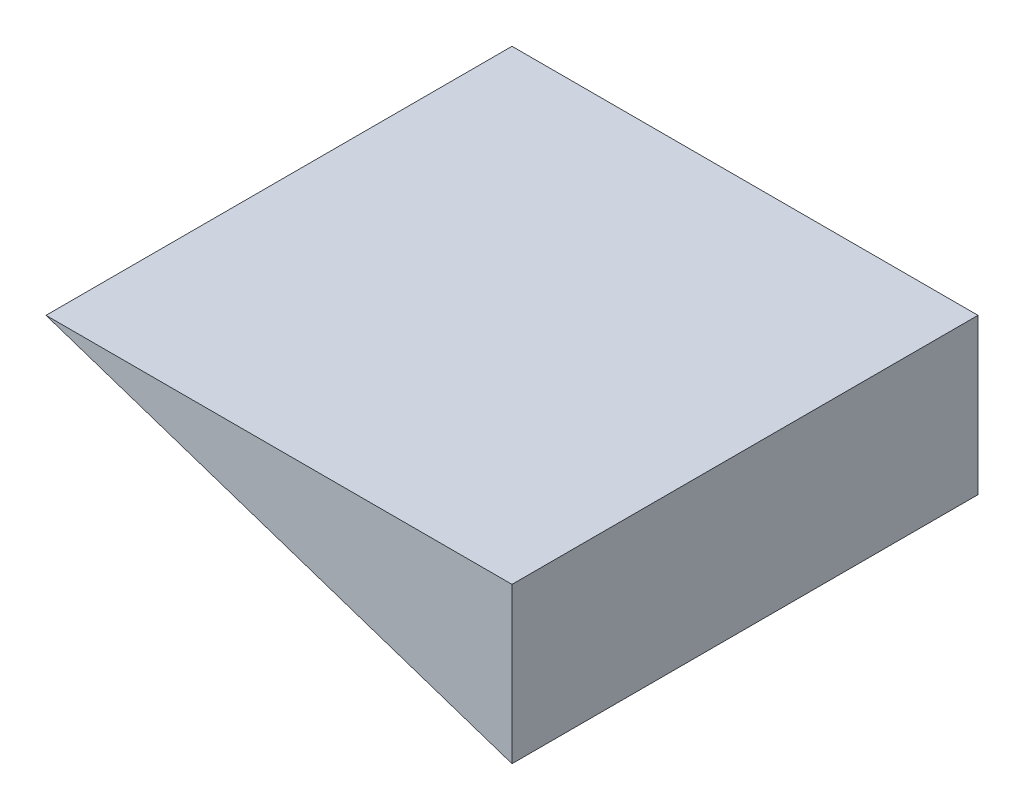
ISO-10303-21;
HEADER;
FILE_DESCRIPTION(('STEP AP214'),'2;1');
FILE_NAME('part.step','',(''),(''),'','','');
FILE_SCHEMA(('AUTOMOTIVE_DESIGN { 1 0 10303 214 1 1 1 1 }'));
ENDSEC;
DATA;
#1=APPLICATION_CONTEXT('core data for automotive mechanical design processes');
#2=APPLICATION_PROTOCOL_DEFINITION('international standard','automotive_design',2000,#1);
#3=PRODUCT_CONTEXT('',#1,'mechanical');
#4=PRODUCT('Part','Part','',(#3));
#5=PRODUCT_RELATED_PRODUCT_CATEGORY('part','',(#4));
#6=PRODUCT_DEFINITION_FORMATION('','',#4);
#7=PRODUCT_DEFINITION_CONTEXT('part definition',#1,'design');
#8=PRODUCT_DEFINITION('design','',#6,#7);
#9=PRODUCT_DEFINITION_SHAPE('','',#8);
#10=(LENGTH_UNIT() NAMED_UNIT(*) SI_UNIT(.MILLI.,.METRE.));
#11=(NAMED_UNIT(*) PLANE_ANGLE_UNIT() SI_UNIT($,.RADIAN.));
#12=(NAMED_UNIT(*) SI_UNIT($,.STERADIAN.) SOLID_ANGLE_UNIT());
#13=UNCERTAINTY_MEASURE_WITH_UNIT(LENGTH_MEASURE(1.E-05),#10,'distance_accuracy_value','');
#14=(GEOMETRIC_REPRESENTATION_CONTEXT(3) GLOBAL_UNCERTAINTY_ASSIGNED_CONTEXT((#13)) GLOBAL_UNIT_ASSIGNED_CONTEXT((#10,
#11,#12)) REPRESENTATION_CONTEXT('',''));
#15=CARTESIAN_POINT('',(0.,0.,0.));
#16=DIRECTION('',(0.,0.,1.));
#17=DIRECTION('',(1.,0.,0.));
#18=AXIS2_PLACEMENT_3D('',#15,#16,#17);
#19=CARTESIAN_POINT('',(41.4394988050527,31.1341686582452,-150.15));
#20=DIRECTION('',(1.,0.,0.));
#21=DIRECTION('',(0.,0.,-1.));
#22=AXIS2_PLACEMENT_3D('',#19,#20,#21);
#23=PLANE('',#22);
#24=DIRECTION('',(0.,1.,0.));
#25=VECTOR('',#24,1.);
#26=CARTESIAN_POINT('',(41.4394988050527,31.1341686582452,-149.85));
#27=LINE('',#26,#25);
#28=CARTESIAN_POINT('',(41.4394988050527,31.0341686582452,-149.85));
#29=VERTEX_POINT('',#28);
#30=CARTESIAN_POINT('',(41.4394988050527,31.1341686582452,-149.85));
#31=VERTEX_POINT('',#30);
#32=EDGE_CURVE('E123',#29,#31,#27,.T.);
#33=ORIENTED_EDGE('',*,*,#32,.F.);
#34=DIRECTION('',(0.,0.,1.));
#35=VECTOR('',#34,1.);
#36=CARTESIAN_POINT('',(41.4394988050527,31.0341686582452,-150.15));
#37=LINE('',#36,#35);
#38=CARTESIAN_POINT('',(41.4394988050527,31.0341686582452,-150.15));
#39=VERTEX_POINT('',#38);
#40=EDGE_CURVE('E47',#39,#29,#37,.T.);
#41=ORIENTED_EDGE('',*,*,#40,.F.);
#42=DIRECTION('',(0.,1.,0.));
#43=VECTOR('',#42,1.);
#44=CARTESIAN_POINT('',(41.4394988050527,31.1341686582452,-150.15));
#45=LINE('',#44,#43);
#46=CARTESIAN_POINT('',(41.4394988050527,31.1341686582452,-150.15));
#47=VERTEX_POINT('',#46);
#48=EDGE_CURVE('E125',#39,#47,#45,.T.);
#49=ORIENTED_EDGE('',*,*,#48,.T.);
#50=DIRECTION('',(0.,0.,1.));
#51=VECTOR('',#50,1.);
#52=CARTESIAN_POINT('',(41.4394988050527,31.1341686582452,-150.15));
#53=LINE('',#52,#51);
#54=EDGE_CURVE('E62',#47,#31,#53,.T.);
#55=ORIENTED_EDGE('',*,*,#54,.T.);
#56=EDGE_LOOP('',(#33,#41,#49,#55));
#57=FACE_BOUND('',#56,.T.);
#58=ADVANCED_FACE('F39',(#57),#23,.T.);
#59=CARTESIAN_POINT('',(41.1394988050527,31.1341686582452,-150.15));
#60=DIRECTION('',(0.,1.,0.));
#61=DIRECTION('',(0.,0.,1.));
#62=AXIS2_PLACEMENT_3D('',#59,#60,#61);
#63=PLANE('',#62);
#64=DIRECTION('',(-1.,0.,0.));
#65=VECTOR('',#64,1.);
#66=CARTESIAN_POINT('',(41.1394988050527,31.1341686582452,-149.85));
#67=LINE('',#66,#65);
#68=CARTESIAN_POINT('',(41.1394988050527,31.1341686582452,-149.85));
#69=VERTEX_POINT('',#68);
#70=EDGE_CURVE('E118',#31,#69,#67,.T.);
#71=ORIENTED_EDGE('',*,*,#70,.F.);
#72=ORIENTED_EDGE('',*,*,#54,.F.);
#73=DIRECTION('',(-1.,0.,0.));
#74=VECTOR('',#73,1.);
#75=CARTESIAN_POINT('',(41.1394988050527,31.1341686582452,-150.15));
#76=LINE('',#75,#74);
#77=CARTESIAN_POINT('',(41.1394988050527,31.1341686582452,-150.15));
#78=VERTEX_POINT('',#77);
#79=EDGE_CURVE('E119',#47,#78,#76,.T.);
#80=ORIENTED_EDGE('',*,*,#79,.T.);
#81=DIRECTION('',(0.,0.,1.));
#82=VECTOR('',#81,1.);
#83=CARTESIAN_POINT('',(41.1394988050527,31.1341686582452,-150.15));
#84=LINE('',#83,#82);
#85=EDGE_CURVE('E108',#78,#69,#84,.T.);
#86=ORIENTED_EDGE('',*,*,#85,.T.);
#87=EDGE_LOOP('',(#71,#72,#80,#86));
#88=FACE_BOUND('',#87,.T.);
#89=ADVANCED_FACE('F117',(#88),#63,.T.);
#90=CARTESIAN_POINT('',(41.2894988050527,31.0841686582452,-150.15));
#91=DIRECTION('',(0.,0.,1.));
#92=DIRECTION('',(1.,0.,0.));
#93=AXIS2_PLACEMENT_3D('',#90,#91,#92);
#94=PLANE('',#93);
#95=ORIENTED_EDGE('',*,*,#48,.F.);
#96=DIRECTION('',(-0.948683298050514,0.316227766016838,0.));
#97=VECTOR('',#96,1.);
#98=CARTESIAN_POINT('',(41.2894988050527,31.0841686582452,-150.15));
#99=LINE('',#98,#97);
#100=EDGE_CURVE('E152',#39,#78,#99,.T.);
#101=ORIENTED_EDGE('',*,*,#100,.T.);
#102=ORIENTED_EDGE('',*,*,#79,.F.);
#103=EDGE_LOOP('',(#95,#101,#102));
#104=FACE_BOUND('',#103,.T.);
#105=ADVANCED_FACE('F180',(#104),#94,.F.);
#106=CARTESIAN_POINT('',(41.2894988050527,31.0841686582452,-149.85));
#107=DIRECTION('',(0.,0.,1.));
#108=DIRECTION('',(1.,0.,0.));
#109=AXIS2_PLACEMENT_3D('',#106,#107,#108);
#110=PLANE('',#109);
#111=DIRECTION('',(-0.948683298050514,0.316227766016838,0.));
#112=VECTOR('',#111,1.);
#113=CARTESIAN_POINT('',(41.4394988050527,31.0341686582452,-149.85));
#114=LINE('',#113,#112);
#115=EDGE_CURVE('E105',#29,#69,#114,.T.);
#116=ORIENTED_EDGE('',*,*,#115,.F.);
#117=ORIENTED_EDGE('',*,*,#32,.T.);
#118=ORIENTED_EDGE('',*,*,#70,.T.);
#119=EDGE_LOOP('',(#116,#117,#118));
#120=FACE_BOUND('',#119,.T.);
#121=ADVANCED_FACE('F122',(#120),#110,.T.);
#122=CARTESIAN_POINT('',(41.4394988050527,31.0341686582452,-150.166));
#123=DIRECTION('',(0.316227766016838,0.948683298050514,0.));
#124=DIRECTION('',(-0.948683298050514,0.316227766016838,0.));
#125=AXIS2_PLACEMENT_3D('',#122,#123,#124);
#126=PLANE('',#125);
#127=DIRECTION('',(-0.948683298050514,0.316227766016838,0.));
#128=VECTOR('',#127,1.);
#129=CARTESIAN_POINT('',(41.4340988050527,31.0359686582452,-149.856));
#130=LINE('',#129,#128);
#131=CARTESIAN_POINT('',(41.4334988050527,31.0361686582452,-149.856));
#132=VERTEX_POINT('',#131);
#133=CARTESIAN_POINT('',(41.1574988050527,31.1281686582452,-149.856));
#134=VERTEX_POINT('',#133);
#135=EDGE_CURVE('E53',#132,#134,#130,.T.);
#136=ORIENTED_EDGE('',*,*,#135,.F.);
#137=DIRECTION('',(0.,0.,-1.));
#138=VECTOR('',#137,1.);
#139=CARTESIAN_POINT('',(41.4334988050527,31.0361686582452,-149.85));
#140=LINE('',#139,#138);
#141=CARTESIAN_POINT('',(41.4334988050527,31.0361686582452,-150.144));
#142=VERTEX_POINT('',#141);
#143=EDGE_CURVE('E11',#132,#142,#140,.T.);
#144=ORIENTED_EDGE('',*,*,#143,.T.);
#145=DIRECTION('',(0.948683298050514,-0.316227766016838,0.));
#146=VECTOR('',#145,1.);
#147=CARTESIAN_POINT('',(41.4340988050527,31.0359686582452,-150.144));
#148=LINE('',#147,#146);
#149=CARTESIAN_POINT('',(41.1574988050527,31.1281686582452,-150.144));
#150=VERTEX_POINT('',#149);
#151=EDGE_CURVE('E115',#150,#142,#148,.T.);
#152=ORIENTED_EDGE('',*,*,#151,.F.);
#153=DIRECTION('',(0.,0.,-1.));
#154=VECTOR('',#153,1.);
#155=CARTESIAN_POINT('',(41.1574988050527,31.1281686582452,-149.856));
#156=LINE('',#155,#154);
#157=EDGE_CURVE('E155',#134,#150,#156,.T.);
#158=ORIENTED_EDGE('',*,*,#157,.F.);
#159=EDGE_LOOP('',(#136,#144,#152,#158));
#160=FACE_BOUND('',#159,.T.);
#161=ORIENTED_EDGE('',*,*,#40,.T.);
#162=ORIENTED_EDGE('',*,*,#115,.T.);
#163=ORIENTED_EDGE('',*,*,#85,.F.);
#164=ORIENTED_EDGE('',*,*,#100,.F.);
#165=EDGE_LOOP('',(#161,#162,#163,#164));
#166=FACE_BOUND('',#165,.T.);
#167=ADVANCED_FACE('F107',(#160,#166),#126,.F.);
#168=CARTESIAN_POINT('',(41.4334988050527,31.0841686582452,-149.85));
#169=DIRECTION('',(-1.,0.,0.));
#170=DIRECTION('',(0.,0.,1.));
#171=AXIS2_PLACEMENT_3D('',#168,#169,#170);
#172=PLANE('',#171);
#173=ORIENTED_EDGE('',*,*,#143,.F.);
#174=DIRECTION('',(0.,1.,0.));
#175=VECTOR('',#174,1.);
#176=CARTESIAN_POINT('',(41.4334988050527,31.0341686582452,-149.856));
#177=LINE('',#176,#175);
#178=CARTESIAN_POINT('',(41.4334988050527,31.1281686582452,-149.856));
#179=VERTEX_POINT('',#178);
#180=EDGE_CURVE('E86',#132,#179,#177,.T.);
#181=ORIENTED_EDGE('',*,*,#180,.T.);
#182=DIRECTION('',(0.,0.,-1.));
#183=VECTOR('',#182,1.);
#184=CARTESIAN_POINT('',(41.4334988050527,31.1281686582452,-149.856));
#185=LINE('',#184,#183);
#186=CARTESIAN_POINT('',(41.4334988050527,31.1281686582452,-150.144));
#187=VERTEX_POINT('',#186);
#188=EDGE_CURVE('E147',#179,#187,#185,.T.);
#189=ORIENTED_EDGE('',*,*,#188,.T.);
#190=DIRECTION('',(0.,-1.,0.));
#191=VECTOR('',#190,1.);
#192=CARTESIAN_POINT('',(41.4334988050527,31.0341686582452,-150.144));
#193=LINE('',#192,#191);
#194=EDGE_CURVE('E141',#187,#142,#193,.T.);
#195=ORIENTED_EDGE('',*,*,#194,.T.);
#196=EDGE_LOOP('',(#173,#181,#189,#195));
#197=FACE_BOUND('',#196,.T.);
#198=ADVANCED_FACE('F164',(#197),#172,.T.);
#199=CARTESIAN_POINT('',(41.4334988050527,31.1281686582452,-149.856));
#200=DIRECTION('',(0.,1.,0.));
#201=DIRECTION('',(0.,0.,1.));
#202=AXIS2_PLACEMENT_3D('',#199,#200,#201);
#203=PLANE('',#202);
#204=DIRECTION('',(-1.,0.,0.));
#205=VECTOR('',#204,1.);
#206=CARTESIAN_POINT('',(41.4334988050527,31.1281686582452,-149.856));
#207=LINE('',#206,#205);
#208=EDGE_CURVE('E137',#179,#134,#207,.T.);
#209=ORIENTED_EDGE('',*,*,#208,.T.);
#210=ORIENTED_EDGE('',*,*,#157,.T.);
#211=DIRECTION('',(-1.,0.,0.));
#212=VECTOR('',#211,1.);
#213=CARTESIAN_POINT('',(41.4334988050527,31.1281686582452,-150.144));
#214=LINE('',#213,#212);
#215=EDGE_CURVE('E79',#187,#150,#214,.T.);
#216=ORIENTED_EDGE('',*,*,#215,.F.);
#217=ORIENTED_EDGE('',*,*,#188,.F.);
#218=EDGE_LOOP('',(#209,#210,#216,#217));
#219=FACE_BOUND('',#218,.T.);
#220=ADVANCED_FACE('F165',(#219),#203,.F.);
#221=CARTESIAN_POINT('',(41.4334988050527,31.0341686582452,-150.144));
#222=DIRECTION('',(0.,0.,-1.));
#223=DIRECTION('',(-1.,0.,0.));
#224=AXIS2_PLACEMENT_3D('',#221,#222,#223);
#225=PLANE('',#224);
#226=ORIENTED_EDGE('',*,*,#215,.T.);
#227=ORIENTED_EDGE('',*,*,#151,.T.);
#228=ORIENTED_EDGE('',*,*,#194,.F.);
#229=EDGE_LOOP('',(#226,#227,#228));
#230=FACE_BOUND('',#229,.T.);
#231=ADVANCED_FACE('F163',(#230),#225,.F.);
#232=CARTESIAN_POINT('',(41.4334988050527,31.0341686582452,-149.856));
#233=DIRECTION('',(0.,0.,1.));
#234=DIRECTION('',(0.,-1.,0.));
#235=AXIS2_PLACEMENT_3D('',#232,#233,#234);
#236=PLANE('',#235);
#237=ORIENTED_EDGE('',*,*,#180,.F.);
#238=ORIENTED_EDGE('',*,*,#135,.T.);
#239=ORIENTED_EDGE('',*,*,#208,.F.);
#240=EDGE_LOOP('',(#237,#238,#239));
#241=FACE_BOUND('',#240,.T.);
#242=ADVANCED_FACE('F167',(#241),#236,.F.);
#243=CLOSED_SHELL('',(#58,#89,#105,#121,#167,#198,#220,#231,#242));
#244=MANIFOLD_SOLID_BREP('B2',#243);
#245=ADVANCED_BREP_SHAPE_REPRESENTATION('',(#18,#244),#14);
#246=SHAPE_DEFINITION_REPRESENTATION(#9,#245);
ENDSEC;
END-ISO-10303-21;
